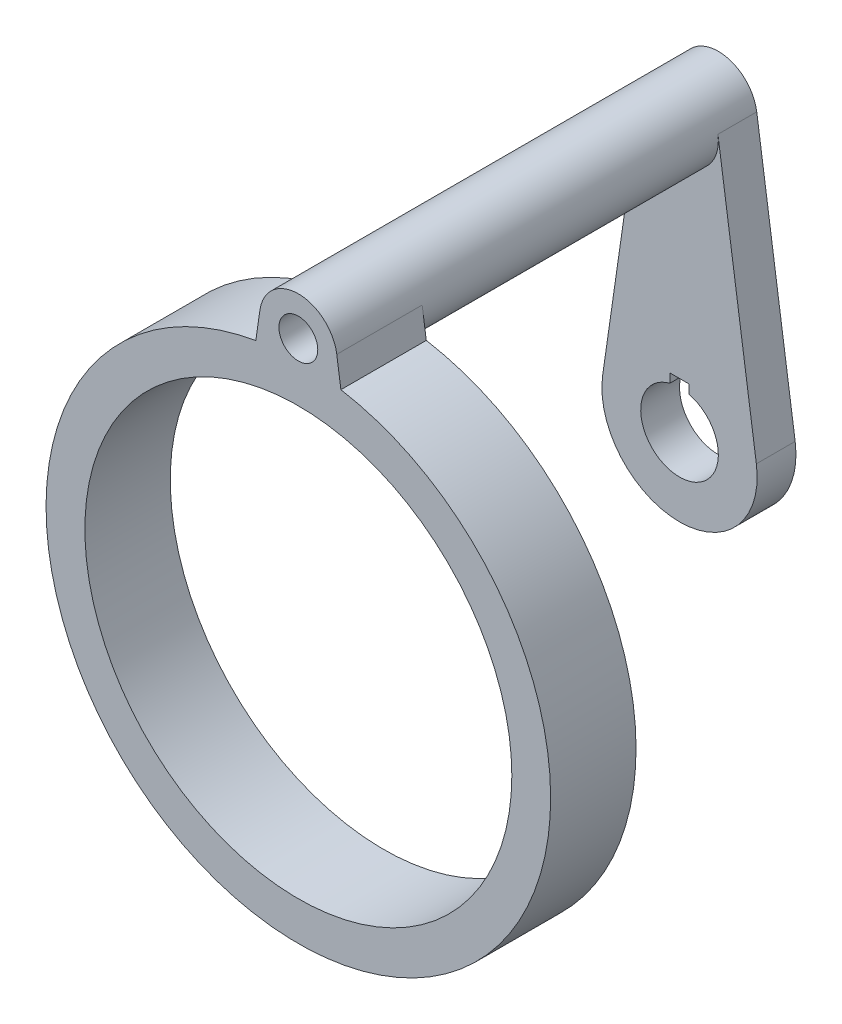
ISO-10303-21;
HEADER;
FILE_DESCRIPTION(('STEP AP214'),'2;1');
FILE_NAME('part.step','',(''),(''),'','','');
FILE_SCHEMA(('AUTOMOTIVE_DESIGN { 1 0 10303 214 1 1 1 1 }'));
ENDSEC;
DATA;
#1=APPLICATION_CONTEXT('core data for automotive mechanical design processes');
#2=APPLICATION_PROTOCOL_DEFINITION('international standard','automotive_design',2000,#1);
#3=PRODUCT_CONTEXT('',#1,'mechanical');
#4=PRODUCT('Part','Part','',(#3));
#5=PRODUCT_RELATED_PRODUCT_CATEGORY('part','',(#4));
#6=PRODUCT_DEFINITION_FORMATION('','',#4);
#7=PRODUCT_DEFINITION_CONTEXT('part definition',#1,'design');
#8=PRODUCT_DEFINITION('design','',#6,#7);
#9=PRODUCT_DEFINITION_SHAPE('','',#8);
#10=(LENGTH_UNIT() NAMED_UNIT(*) SI_UNIT(.MILLI.,.METRE.));
#11=(NAMED_UNIT(*) PLANE_ANGLE_UNIT() SI_UNIT($,.RADIAN.));
#12=(NAMED_UNIT(*) SI_UNIT($,.STERADIAN.) SOLID_ANGLE_UNIT());
#13=UNCERTAINTY_MEASURE_WITH_UNIT(LENGTH_MEASURE(1.E-05),#10,'distance_accuracy_value','');
#14=(GEOMETRIC_REPRESENTATION_CONTEXT(3) GLOBAL_UNCERTAINTY_ASSIGNED_CONTEXT((#13)) GLOBAL_UNIT_ASSIGNED_CONTEXT((#10,
#11,#12)) REPRESENTATION_CONTEXT('',''));
#15=CARTESIAN_POINT('',(0.,0.,0.));
#16=DIRECTION('',(0.,0.,1.));
#17=DIRECTION('',(1.,0.,0.));
#18=AXIS2_PLACEMENT_3D('',#15,#16,#17);
#19=CARTESIAN_POINT('',(0.,0.,10.));
#20=DIRECTION('',(0.,0.,1.));
#21=DIRECTION('',(1.,0.,0.));
#22=AXIS2_PLACEMENT_3D('',#19,#20,#21);
#23=PLANE('',#22);
#24=CARTESIAN_POINT('',(0.,70.,10.));
#25=DIRECTION('',(0.,0.,1.));
#26=DIRECTION('',(1.,0.,0.));
#27=AXIS2_PLACEMENT_3D('',#24,#25,#26);
#28=CIRCLE('',#27,10.);
#29=CARTESIAN_POINT('',(-9.89743318610788,71.4285714285714,10.));
#30=VERTEX_POINT('',#29);
#31=CARTESIAN_POINT('',(9.89743318610788,71.4285714285714,10.));
#32=VERTEX_POINT('',#31);
#33=EDGE_CURVE('E54',#30,#32,#28,.T.);
#34=ORIENTED_EDGE('',*,*,#33,.F.);
#35=DIRECTION('',(-0.142857142857143,-0.989743318610787,0.));
#36=VECTOR('',#35,1.);
#37=CARTESIAN_POINT('',(-19.7948663722158,2.85714285714286,10.));
#38=LINE('',#37,#36);
#39=CARTESIAN_POINT('',(-19.7948663722158,2.85714285714286,10.));
#40=VERTEX_POINT('',#39);
#41=EDGE_CURVE('E235',#30,#40,#38,.T.);
#42=ORIENTED_EDGE('',*,*,#41,.T.);
#43=CARTESIAN_POINT('',(0.,0.,10.));
#44=DIRECTION('',(0.,0.,1.));
#45=DIRECTION('',(1.,0.,0.));
#46=AXIS2_PLACEMENT_3D('',#43,#44,#45);
#47=CIRCLE('',#46,20.);
#48=CARTESIAN_POINT('',(19.7948663722157,2.85714285714286,10.));
#49=VERTEX_POINT('',#48);
#50=EDGE_CURVE('E226',#40,#49,#47,.T.);
#51=ORIENTED_EDGE('',*,*,#50,.T.);
#52=DIRECTION('',(-0.142857142857143,0.989743318610787,0.));
#53=VECTOR('',#52,1.);
#54=CARTESIAN_POINT('',(9.89743318610787,71.4285714285714,10.));
#55=LINE('',#54,#53);
#56=EDGE_CURVE('E230',#49,#32,#55,.T.);
#57=ORIENTED_EDGE('',*,*,#56,.T.);
#58=EDGE_LOOP('',(#34,#42,#51,#57));
#59=FACE_BOUND('',#58,.T.);
#60=DIRECTION('',(0.,1.,0.));
#61=VECTOR('',#60,1.);
#62=CARTESIAN_POINT('',(2.5,12.,10.));
#63=LINE('',#62,#61);
#64=CARTESIAN_POINT('',(2.5,9.68245836551854,10.));
#65=VERTEX_POINT('',#64);
#66=CARTESIAN_POINT('',(2.5,12.,10.));
#67=VERTEX_POINT('',#66);
#68=EDGE_CURVE('E188',#65,#67,#63,.T.);
#69=ORIENTED_EDGE('',*,*,#68,.F.);
#70=CARTESIAN_POINT('',(0.,0.,10.));
#71=DIRECTION('',(0.,0.,1.));
#72=DIRECTION('',(1.,0.,0.));
#73=AXIS2_PLACEMENT_3D('',#70,#71,#72);
#74=CIRCLE('',#73,10.);
#75=CARTESIAN_POINT('',(-2.5,9.68245836551854,10.));
#76=VERTEX_POINT('',#75);
#77=EDGE_CURVE('E185',#76,#65,#74,.T.);
#78=ORIENTED_EDGE('',*,*,#77,.F.);
#79=DIRECTION('',(0.,-1.,0.));
#80=VECTOR('',#79,1.);
#81=CARTESIAN_POINT('',(-2.5,9.68245836551854,10.));
#82=LINE('',#81,#80);
#83=CARTESIAN_POINT('',(-2.5,12.,10.));
#84=VERTEX_POINT('',#83);
#85=EDGE_CURVE('E195',#84,#76,#82,.T.);
#86=ORIENTED_EDGE('',*,*,#85,.F.);
#87=DIRECTION('',(-1.,0.,0.));
#88=VECTOR('',#87,1.);
#89=CARTESIAN_POINT('',(-2.5,12.,10.));
#90=LINE('',#89,#88);
#91=EDGE_CURVE('E192',#67,#84,#90,.T.);
#92=ORIENTED_EDGE('',*,*,#91,.F.);
#93=EDGE_LOOP('',(#69,#78,#86,#92));
#94=FACE_BOUND('',#93,.T.);
#95=ADVANCED_FACE('F45',(#59,#94),#23,.T.);
#96=CARTESIAN_POINT('',(0.,0.,0.));
#97=DIRECTION('',(0.,0.,1.));
#98=DIRECTION('',(1.,0.,0.));
#99=AXIS2_PLACEMENT_3D('',#96,#97,#98);
#100=PLANE('',#99);
#101=CARTESIAN_POINT('',(0.,0.,0.));
#102=DIRECTION('',(0.,0.,1.));
#103=DIRECTION('',(1.,0.,0.));
#104=AXIS2_PLACEMENT_3D('',#101,#102,#103);
#105=CIRCLE('',#104,20.);
#106=CARTESIAN_POINT('',(-19.7948663722158,2.85714285714286,0.));
#107=VERTEX_POINT('',#106);
#108=CARTESIAN_POINT('',(19.7948663722157,2.85714285714286,0.));
#109=VERTEX_POINT('',#108);
#110=EDGE_CURVE('E225',#107,#109,#105,.T.);
#111=ORIENTED_EDGE('',*,*,#110,.F.);
#112=DIRECTION('',(-0.142857142857143,-0.989743318610787,0.));
#113=VECTOR('',#112,1.);
#114=CARTESIAN_POINT('',(-19.7948663722158,2.85714285714286,0.));
#115=LINE('',#114,#113);
#116=CARTESIAN_POINT('',(-9.89743318610788,71.4285714285714,0.));
#117=VERTEX_POINT('',#116);
#118=EDGE_CURVE('E231',#117,#107,#115,.T.);
#119=ORIENTED_EDGE('',*,*,#118,.F.);
#120=CARTESIAN_POINT('',(0.,70.,0.));
#121=DIRECTION('',(0.,0.,1.));
#122=DIRECTION('',(1.,0.,0.));
#123=AXIS2_PLACEMENT_3D('',#120,#121,#122);
#124=CIRCLE('',#123,10.);
#125=CARTESIAN_POINT('',(9.89743318610787,71.4285714285714,0.));
#126=VERTEX_POINT('',#125);
#127=EDGE_CURVE('E245',#126,#117,#124,.T.);
#128=ORIENTED_EDGE('',*,*,#127,.F.);
#129=DIRECTION('',(-0.142857142857143,0.989743318610787,0.));
#130=VECTOR('',#129,1.);
#131=CARTESIAN_POINT('',(9.89743318610787,71.4285714285714,0.));
#132=LINE('',#131,#130);
#133=EDGE_CURVE('E242',#109,#126,#132,.T.);
#134=ORIENTED_EDGE('',*,*,#133,.F.);
#135=EDGE_LOOP('',(#111,#119,#128,#134));
#136=FACE_BOUND('',#135,.T.);
#137=CARTESIAN_POINT('',(0.,0.,0.));
#138=DIRECTION('',(0.,0.,1.));
#139=DIRECTION('',(1.,0.,0.));
#140=AXIS2_PLACEMENT_3D('',#137,#138,#139);
#141=CIRCLE('',#140,10.);
#142=CARTESIAN_POINT('',(-2.5,9.68245836551854,0.));
#143=VERTEX_POINT('',#142);
#144=CARTESIAN_POINT('',(2.5,9.68245836551854,0.));
#145=VERTEX_POINT('',#144);
#146=EDGE_CURVE('E184',#143,#145,#141,.T.);
#147=ORIENTED_EDGE('',*,*,#146,.T.);
#148=DIRECTION('',(0.,1.,0.));
#149=VECTOR('',#148,1.);
#150=CARTESIAN_POINT('',(2.5,12.,0.));
#151=LINE('',#150,#149);
#152=CARTESIAN_POINT('',(2.5,12.,0.));
#153=VERTEX_POINT('',#152);
#154=EDGE_CURVE('E202',#145,#153,#151,.T.);
#155=ORIENTED_EDGE('',*,*,#154,.T.);
#156=DIRECTION('',(-1.,0.,0.));
#157=VECTOR('',#156,1.);
#158=CARTESIAN_POINT('',(-2.5,12.,0.));
#159=LINE('',#158,#157);
#160=CARTESIAN_POINT('',(-2.5,12.,0.));
#161=VERTEX_POINT('',#160);
#162=EDGE_CURVE('E206',#153,#161,#159,.T.);
#163=ORIENTED_EDGE('',*,*,#162,.T.);
#164=DIRECTION('',(0.,-1.,0.));
#165=VECTOR('',#164,1.);
#166=CARTESIAN_POINT('',(-2.5,9.68245836551854,0.));
#167=LINE('',#166,#165);
#168=EDGE_CURVE('E189',#161,#143,#167,.T.);
#169=ORIENTED_EDGE('',*,*,#168,.T.);
#170=EDGE_LOOP('',(#147,#155,#163,#169));
#171=FACE_BOUND('',#170,.T.);
#172=CARTESIAN_POINT('',(0.,70.,0.));
#173=DIRECTION('',(0.,0.,1.));
#174=DIRECTION('',(1.,0.,0.));
#175=AXIS2_PLACEMENT_3D('',#172,#173,#174);
#176=CIRCLE('',#175,5.);
#177=CARTESIAN_POINT('',(5.,70.,0.));
#178=VERTEX_POINT('',#177);
#179=EDGE_CURVE('E176',#178,#178,#176,.T.);
#180=ORIENTED_EDGE('',*,*,#179,.T.);
#181=EDGE_LOOP('',(#180));
#182=FACE_BOUND('',#181,.T.);
#183=ADVANCED_FACE('F271',(#136,#171,#182),#100,.F.);
#184=CARTESIAN_POINT('',(0.,0.,10.));
#185=DIRECTION('',(0.,0.,-1.));
#186=DIRECTION('',(-1.,0.,0.));
#187=AXIS2_PLACEMENT_3D('',#184,#185,#186);
#188=CYLINDRICAL_SURFACE('',#187,20.);
#189=ORIENTED_EDGE('',*,*,#110,.T.);
#190=DIRECTION('',(0.,0.,-1.));
#191=VECTOR('',#190,1.);
#192=CARTESIAN_POINT('',(19.7948663722157,2.85714285714286,10.));
#193=LINE('',#192,#191);
#194=EDGE_CURVE('E180',#49,#109,#193,.T.);
#195=ORIENTED_EDGE('',*,*,#194,.F.);
#196=ORIENTED_EDGE('',*,*,#50,.F.);
#197=DIRECTION('',(0.,0.,-1.));
#198=VECTOR('',#197,1.);
#199=CARTESIAN_POINT('',(-19.7948663722158,2.85714285714286,10.));
#200=LINE('',#199,#198);
#201=EDGE_CURVE('E238',#40,#107,#200,.T.);
#202=ORIENTED_EDGE('',*,*,#201,.T.);
#203=EDGE_LOOP('',(#189,#195,#196,#202));
#204=FACE_BOUND('',#203,.T.);
#205=ADVANCED_FACE('F47',(#204),#188,.T.);
#206=CARTESIAN_POINT('',(9.89743318610787,71.4285714285714,10.));
#207=DIRECTION('',(-0.989743318610787,-0.142857142857143,0.));
#208=DIRECTION('',(0.142857142857143,-0.989743318610787,0.));
#209=AXIS2_PLACEMENT_3D('',#206,#207,#208);
#210=PLANE('',#209);
#211=ORIENTED_EDGE('',*,*,#133,.T.);
#212=DIRECTION('',(0.,0.,-1.));
#213=VECTOR('',#212,1.);
#214=CARTESIAN_POINT('',(9.89743318610787,71.4285714285714,10.));
#215=LINE('',#214,#213);
#216=EDGE_CURVE('E257',#32,#126,#215,.T.);
#217=ORIENTED_EDGE('',*,*,#216,.F.);
#218=ORIENTED_EDGE('',*,*,#56,.F.);
#219=ORIENTED_EDGE('',*,*,#194,.T.);
#220=EDGE_LOOP('',(#211,#217,#218,#219));
#221=FACE_BOUND('',#220,.T.);
#222=ADVANCED_FACE('F264',(#221),#210,.F.);
#223=CARTESIAN_POINT('',(0.,70.,10.));
#224=DIRECTION('',(0.,0.,-1.));
#225=DIRECTION('',(-1.,0.,0.));
#226=AXIS2_PLACEMENT_3D('',#223,#224,#225);
#227=CYLINDRICAL_SURFACE('',#226,10.);
#228=ORIENTED_EDGE('',*,*,#127,.T.);
#229=DIRECTION('',(0.,0.,-1.));
#230=VECTOR('',#229,1.);
#231=CARTESIAN_POINT('',(-9.89743318610788,71.4285714285714,10.));
#232=LINE('',#231,#230);
#233=EDGE_CURVE('E253',#30,#117,#232,.T.);
#234=ORIENTED_EDGE('',*,*,#233,.F.);
#235=ORIENTED_EDGE('',*,*,#33,.T.);
#236=ORIENTED_EDGE('',*,*,#216,.T.);
#237=EDGE_LOOP('',(#228,#234,#235,#236));
#238=FACE_BOUND('',#237,.T.);
#239=CARTESIAN_POINT('',(0.,70.,86.2));
#240=DIRECTION('',(0.,0.,1.));
#241=DIRECTION('',(1.,0.,0.));
#242=AXIS2_PLACEMENT_3D('',#239,#240,#241);
#243=CIRCLE('',#242,10.);
#244=CARTESIAN_POINT('',(-9.89743318610788,71.4285714285714,86.2));
#245=VERTEX_POINT('',#244);
#246=CARTESIAN_POINT('',(9.89743318610787,71.4285714285714,86.2));
#247=VERTEX_POINT('',#246);
#248=EDGE_CURVE('E173',#245,#247,#243,.T.);
#249=ORIENTED_EDGE('',*,*,#248,.F.);
#250=DIRECTION('',(0.,0.,-1.));
#251=VECTOR('',#250,1.);
#252=CARTESIAN_POINT('',(-9.89743318610788,71.4285714285714,108.2));
#253=LINE('',#252,#251);
#254=CARTESIAN_POINT('',(-9.89743318610788,71.4285714285714,108.2));
#255=VERTEX_POINT('',#254);
#256=EDGE_CURVE('E154',#255,#245,#253,.T.);
#257=ORIENTED_EDGE('',*,*,#256,.F.);
#258=CARTESIAN_POINT('',(0.,70.,108.2));
#259=DIRECTION('',(0.,0.,1.));
#260=DIRECTION('',(1.,0.,0.));
#261=AXIS2_PLACEMENT_3D('',#258,#259,#260);
#262=CIRCLE('',#261,10.);
#263=CARTESIAN_POINT('',(9.89743318610787,71.4285714285714,108.2));
#264=VERTEX_POINT('',#263);
#265=EDGE_CURVE('E159',#264,#255,#262,.T.);
#266=ORIENTED_EDGE('',*,*,#265,.F.);
#267=DIRECTION('',(0.,0.,-1.));
#268=VECTOR('',#267,1.);
#269=CARTESIAN_POINT('',(9.89743318610787,71.4285714285714,108.2));
#270=LINE('',#269,#268);
#271=EDGE_CURVE('E167',#264,#247,#270,.T.);
#272=ORIENTED_EDGE('',*,*,#271,.T.);
#273=EDGE_LOOP('',(#249,#257,#266,#272));
#274=FACE_BOUND('',#273,.T.);
#275=ADVANCED_FACE('F276',(#238,#274),#227,.T.);
#276=CARTESIAN_POINT('',(-19.7948663722158,2.85714285714286,10.));
#277=DIRECTION('',(0.989743318610787,-0.142857142857143,0.));
#278=DIRECTION('',(0.142857142857143,0.989743318610787,0.));
#279=AXIS2_PLACEMENT_3D('',#276,#277,#278);
#280=PLANE('',#279);
#281=ORIENTED_EDGE('',*,*,#118,.T.);
#282=ORIENTED_EDGE('',*,*,#201,.F.);
#283=ORIENTED_EDGE('',*,*,#41,.F.);
#284=ORIENTED_EDGE('',*,*,#233,.T.);
#285=EDGE_LOOP('',(#281,#282,#283,#284));
#286=FACE_BOUND('',#285,.T.);
#287=ADVANCED_FACE('F280',(#286),#280,.F.);
#288=CARTESIAN_POINT('',(0.,0.,10.));
#289=DIRECTION('',(0.,0.,-1.));
#290=DIRECTION('',(-1.,0.,0.));
#291=AXIS2_PLACEMENT_3D('',#288,#289,#290);
#292=CYLINDRICAL_SURFACE('',#291,10.);
#293=ORIENTED_EDGE('',*,*,#146,.F.);
#294=DIRECTION('',(0.,0.,-1.));
#295=VECTOR('',#294,1.);
#296=CARTESIAN_POINT('',(-2.5,9.68245836551854,10.));
#297=LINE('',#296,#295);
#298=EDGE_CURVE('E198',#76,#143,#297,.T.);
#299=ORIENTED_EDGE('',*,*,#298,.F.);
#300=ORIENTED_EDGE('',*,*,#77,.T.);
#301=DIRECTION('',(0.,0.,-1.));
#302=VECTOR('',#301,1.);
#303=CARTESIAN_POINT('',(2.5,9.68245836551854,10.));
#304=LINE('',#303,#302);
#305=EDGE_CURVE('E221',#65,#145,#304,.T.);
#306=ORIENTED_EDGE('',*,*,#305,.T.);
#307=EDGE_LOOP('',(#293,#299,#300,#306));
#308=FACE_BOUND('',#307,.T.);
#309=ADVANCED_FACE('F298',(#308),#292,.F.);
#310=CARTESIAN_POINT('',(2.5,12.,10.));
#311=DIRECTION('',(-1.,0.,0.));
#312=DIRECTION('',(0.,0.,1.));
#313=AXIS2_PLACEMENT_3D('',#310,#311,#312);
#314=PLANE('',#313);
#315=ORIENTED_EDGE('',*,*,#154,.F.);
#316=ORIENTED_EDGE('',*,*,#305,.F.);
#317=ORIENTED_EDGE('',*,*,#68,.T.);
#318=DIRECTION('',(0.,0.,-1.));
#319=VECTOR('',#318,1.);
#320=CARTESIAN_POINT('',(2.5,12.,10.));
#321=LINE('',#320,#319);
#322=EDGE_CURVE('E218',#67,#153,#321,.T.);
#323=ORIENTED_EDGE('',*,*,#322,.T.);
#324=EDGE_LOOP('',(#315,#316,#317,#323));
#325=FACE_BOUND('',#324,.T.);
#326=ADVANCED_FACE('F292',(#325),#314,.T.);
#327=CARTESIAN_POINT('',(-2.5,12.,10.));
#328=DIRECTION('',(0.,-1.,0.));
#329=DIRECTION('',(0.,0.,-1.));
#330=AXIS2_PLACEMENT_3D('',#327,#328,#329);
#331=PLANE('',#330);
#332=ORIENTED_EDGE('',*,*,#162,.F.);
#333=ORIENTED_EDGE('',*,*,#322,.F.);
#334=ORIENTED_EDGE('',*,*,#91,.T.);
#335=DIRECTION('',(0.,0.,-1.));
#336=VECTOR('',#335,1.);
#337=CARTESIAN_POINT('',(-2.5,12.,10.));
#338=LINE('',#337,#336);
#339=EDGE_CURVE('E69',#84,#161,#338,.T.);
#340=ORIENTED_EDGE('',*,*,#339,.T.);
#341=EDGE_LOOP('',(#332,#333,#334,#340));
#342=FACE_BOUND('',#341,.T.);
#343=ADVANCED_FACE('F295',(#342),#331,.T.);
#344=CARTESIAN_POINT('',(-2.5,9.68245836551854,10.));
#345=DIRECTION('',(1.,0.,0.));
#346=DIRECTION('',(0.,0.,-1.));
#347=AXIS2_PLACEMENT_3D('',#344,#345,#346);
#348=PLANE('',#347);
#349=ORIENTED_EDGE('',*,*,#168,.F.);
#350=ORIENTED_EDGE('',*,*,#339,.F.);
#351=ORIENTED_EDGE('',*,*,#85,.T.);
#352=ORIENTED_EDGE('',*,*,#298,.T.);
#353=EDGE_LOOP('',(#349,#350,#351,#352));
#354=FACE_BOUND('',#353,.T.);
#355=ADVANCED_FACE('F300',(#354),#348,.T.);
#356=CARTESIAN_POINT('',(0.,70.,10.));
#357=DIRECTION('',(0.,0.,-1.));
#358=DIRECTION('',(-1.,0.,0.));
#359=AXIS2_PLACEMENT_3D('',#356,#357,#358);
#360=CYLINDRICAL_SURFACE('',#359,5.);
#361=CARTESIAN_POINT('',(0.,70.,108.2));
#362=DIRECTION('',(0.,0.,1.));
#363=DIRECTION('',(1.,0.,0.));
#364=AXIS2_PLACEMENT_3D('',#361,#362,#363);
#365=CIRCLE('',#364,5.);
#366=CARTESIAN_POINT('',(5.,70.,108.2));
#367=VERTEX_POINT('',#366);
#368=EDGE_CURVE('E143',#367,#367,#365,.T.);
#369=ORIENTED_EDGE('',*,*,#368,.T.);
#370=EDGE_LOOP('',(#369));
#371=FACE_BOUND('',#370,.T.);
#372=ORIENTED_EDGE('',*,*,#179,.F.);
#373=EDGE_LOOP('',(#372));
#374=FACE_BOUND('',#373,.T.);
#375=ADVANCED_FACE('F302',(#371,#374),#360,.F.);
#376=CARTESIAN_POINT('',(0.,70.,86.2));
#377=DIRECTION('',(0.,0.,1.));
#378=DIRECTION('',(1.,0.,0.));
#379=AXIS2_PLACEMENT_3D('',#376,#377,#378);
#380=PLANE('',#379);
#381=CARTESIAN_POINT('',(0.,0.,86.2));
#382=DIRECTION('',(0.,0.,1.));
#383=DIRECTION('',(1.,0.,0.));
#384=AXIS2_PLACEMENT_3D('',#381,#382,#383);
#385=CIRCLE('',#384,55.);
#386=CARTESIAN_POINT('',(55.,0.,86.2));
#387=VERTEX_POINT('',#386);
#388=EDGE_CURVE('E463',#387,#387,#385,.F.);
#389=ORIENTED_EDGE('',*,*,#388,.F.);
#390=EDGE_LOOP('',(#389));
#391=FACE_BOUND('',#390,.T.);
#392=ORIENTED_EDGE('',*,*,#248,.T.);
#393=DIRECTION('',(0.142857142857143,-0.989743318610787,0.));
#394=VECTOR('',#393,1.);
#395=CARTESIAN_POINT('',(9.89743318610787,71.4285714285714,86.2));
#396=LINE('',#395,#394);
#397=CARTESIAN_POINT('',(10.9596400316065,64.0693865303673,86.2));
#398=VERTEX_POINT('',#397);
#399=EDGE_CURVE('E148',#247,#398,#396,.T.);
#400=ORIENTED_EDGE('',*,*,#399,.T.);
#401=CARTESIAN_POINT('',(0.,0.,86.2));
#402=DIRECTION('',(0.,0.,1.));
#403=DIRECTION('',(1.,0.,0.));
#404=AXIS2_PLACEMENT_3D('',#401,#402,#403);
#405=CIRCLE('',#404,65.);
#406=CARTESIAN_POINT('',(-10.9596400316065,64.0693865303673,86.2));
#407=VERTEX_POINT('',#406);
#408=EDGE_CURVE('E136',#398,#407,#405,.F.);
#409=ORIENTED_EDGE('',*,*,#408,.T.);
#410=DIRECTION('',(0.142857142857143,0.989743318610787,0.));
#411=VECTOR('',#410,1.);
#412=CARTESIAN_POINT('',(-9.89743318610788,71.4285714285714,86.2));
#413=LINE('',#412,#411);
#414=EDGE_CURVE('E61',#407,#245,#413,.T.);
#415=ORIENTED_EDGE('',*,*,#414,.T.);
#416=EDGE_LOOP('',(#392,#400,#409,#415));
#417=FACE_BOUND('',#416,.T.);
#418=ADVANCED_FACE('F146',(#391,#417),#380,.F.);
#419=CARTESIAN_POINT('',(0.,70.,108.2));
#420=DIRECTION('',(0.,0.,1.));
#421=DIRECTION('',(1.,0.,0.));
#422=AXIS2_PLACEMENT_3D('',#419,#420,#421);
#423=PLANE('',#422);
#424=CARTESIAN_POINT('',(0.,0.,108.2));
#425=DIRECTION('',(0.,0.,1.));
#426=DIRECTION('',(1.,0.,0.));
#427=AXIS2_PLACEMENT_3D('',#424,#425,#426);
#428=CIRCLE('',#427,55.);
#429=CARTESIAN_POINT('',(55.,0.,108.2));
#430=VERTEX_POINT('',#429);
#431=EDGE_CURVE('E466',#430,#430,#428,.T.);
#432=ORIENTED_EDGE('',*,*,#431,.F.);
#433=EDGE_LOOP('',(#432));
#434=FACE_BOUND('',#433,.T.);
#435=ORIENTED_EDGE('',*,*,#368,.F.);
#436=EDGE_LOOP('',(#435));
#437=FACE_BOUND('',#436,.T.);
#438=CARTESIAN_POINT('',(0.,0.,108.2));
#439=DIRECTION('',(0.,0.,1.));
#440=DIRECTION('',(1.,0.,0.));
#441=AXIS2_PLACEMENT_3D('',#438,#439,#440);
#442=CIRCLE('',#441,65.);
#443=CARTESIAN_POINT('',(-10.9596400316065,64.0693865303673,108.2));
#444=VERTEX_POINT('',#443);
#445=CARTESIAN_POINT('',(10.9596400316065,64.0693865303673,108.2));
#446=VERTEX_POINT('',#445);
#447=EDGE_CURVE('E139',#444,#446,#442,.T.);
#448=ORIENTED_EDGE('',*,*,#447,.T.);
#449=DIRECTION('',(0.142857142857143,-0.989743318610787,0.));
#450=VECTOR('',#449,1.);
#451=CARTESIAN_POINT('',(9.89743318610787,71.4285714285714,108.2));
#452=LINE('',#451,#450);
#453=EDGE_CURVE('E164',#264,#446,#452,.T.);
#454=ORIENTED_EDGE('',*,*,#453,.F.);
#455=ORIENTED_EDGE('',*,*,#265,.T.);
#456=DIRECTION('',(0.142857142857143,0.989743318610787,0.));
#457=VECTOR('',#456,1.);
#458=CARTESIAN_POINT('',(-9.89743318610788,71.4285714285714,108.2));
#459=LINE('',#458,#457);
#460=EDGE_CURVE('E476',#444,#255,#459,.T.);
#461=ORIENTED_EDGE('',*,*,#460,.F.);
#462=EDGE_LOOP('',(#448,#454,#455,#461));
#463=FACE_BOUND('',#462,.T.);
#464=ADVANCED_FACE('F366',(#434,#437,#463),#423,.T.);
#465=CARTESIAN_POINT('',(-9.89743318610788,71.4285714285714,108.2));
#466=DIRECTION('',(-0.989743318610787,0.142857142857143,0.));
#467=DIRECTION('',(-0.142857142857143,-0.989743318610787,0.));
#468=AXIS2_PLACEMENT_3D('',#465,#466,#467);
#469=PLANE('',#468);
#470=DIRECTION('',(0.,0.,1.));
#471=VECTOR('',#470,1.);
#472=CARTESIAN_POINT('',(-10.9596400316065,64.0693865303673,-97.6477631085024));
#473=LINE('',#472,#471);
#474=EDGE_CURVE('E134',#444,#407,#473,.F.);
#475=ORIENTED_EDGE('',*,*,#474,.F.);
#476=ORIENTED_EDGE('',*,*,#460,.T.);
#477=ORIENTED_EDGE('',*,*,#256,.T.);
#478=ORIENTED_EDGE('',*,*,#414,.F.);
#479=EDGE_LOOP('',(#475,#476,#477,#478));
#480=FACE_BOUND('',#479,.T.);
#481=ADVANCED_FACE('F152',(#480),#469,.T.);
#482=CARTESIAN_POINT('',(9.89743318610787,71.4285714285714,108.2));
#483=DIRECTION('',(0.989743318610787,0.142857142857143,0.));
#484=DIRECTION('',(-0.142857142857143,0.989743318610787,0.));
#485=AXIS2_PLACEMENT_3D('',#482,#483,#484);
#486=PLANE('',#485);
#487=DIRECTION('',(0.,0.,1.));
#488=VECTOR('',#487,1.);
#489=CARTESIAN_POINT('',(10.9596400316065,64.0693865303673,-97.6477631085024));
#490=LINE('',#489,#488);
#491=EDGE_CURVE('E11',#398,#446,#490,.T.);
#492=ORIENTED_EDGE('',*,*,#491,.F.);
#493=ORIENTED_EDGE('',*,*,#399,.F.);
#494=ORIENTED_EDGE('',*,*,#271,.F.);
#495=ORIENTED_EDGE('',*,*,#453,.T.);
#496=EDGE_LOOP('',(#492,#493,#494,#495));
#497=FACE_BOUND('',#496,.T.);
#498=ADVANCED_FACE('F365',(#497),#486,.T.);
#499=CARTESIAN_POINT('',(0.,0.,-97.6477631085024));
#500=DIRECTION('',(0.,0.,1.));
#501=DIRECTION('',(1.,0.,0.));
#502=AXIS2_PLACEMENT_3D('',#499,#500,#501);
#503=CYLINDRICAL_SURFACE('',#502,65.);
#504=ORIENTED_EDGE('',*,*,#447,.F.);
#505=ORIENTED_EDGE('',*,*,#474,.T.);
#506=ORIENTED_EDGE('',*,*,#408,.F.);
#507=ORIENTED_EDGE('',*,*,#491,.T.);
#508=EDGE_LOOP('',(#504,#505,#506,#507));
#509=FACE_BOUND('',#508,.T.);
#510=ADVANCED_FACE('F135',(#509),#503,.T.);
#511=CARTESIAN_POINT('',(0.,0.,-69.3634918610405));
#512=DIRECTION('',(0.,0.,1.));
#513=DIRECTION('',(1.,0.,0.));
#514=AXIS2_PLACEMENT_3D('',#511,#512,#513);
#515=CYLINDRICAL_SURFACE('',#514,55.);
#516=ORIENTED_EDGE('',*,*,#388,.T.);
#517=EDGE_LOOP('',(#516));
#518=FACE_BOUND('',#517,.T.);
#519=ORIENTED_EDGE('',*,*,#431,.T.);
#520=EDGE_LOOP('',(#519));
#521=FACE_BOUND('',#520,.T.);
#522=ADVANCED_FACE('F383',(#518,#521),#515,.F.);
#523=CLOSED_SHELL('',(#95,#183,#205,#222,#275,#287,#309,#326,#343,#355,#375,#418,#464,#481,#498,
#510,#522));
#524=MANIFOLD_SOLID_BREP('B2',#523);
#525=ADVANCED_BREP_SHAPE_REPRESENTATION('',(#18,#524),#14);
#526=SHAPE_DEFINITION_REPRESENTATION(#9,#525);
ENDSEC;
END-ISO-10303-21;
